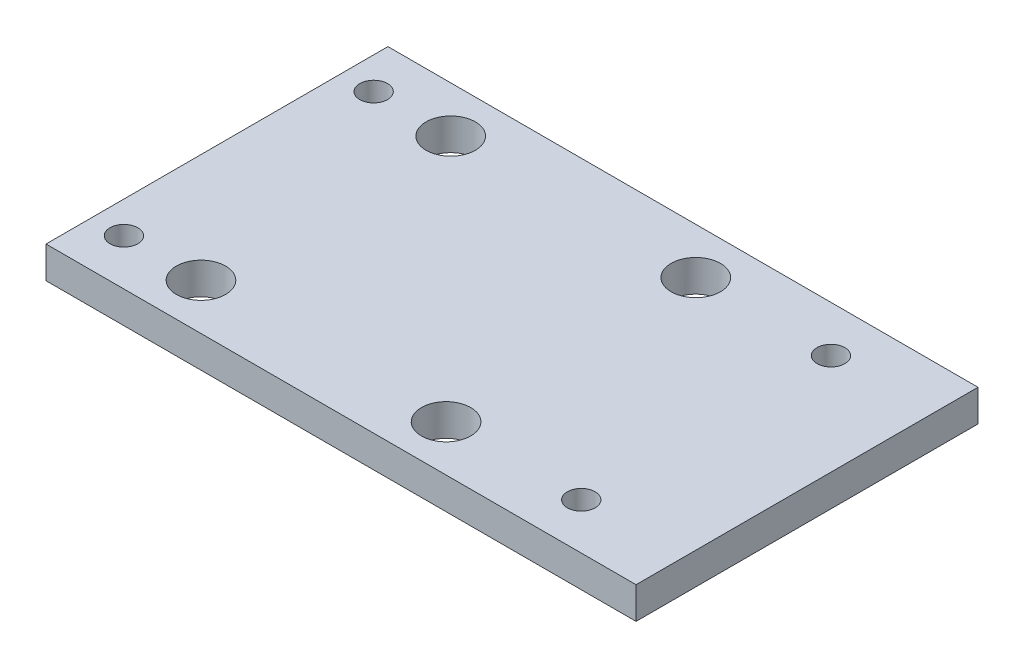
ISO-10303-21;
HEADER;
FILE_DESCRIPTION(('STEP AP214'),'2;1');
FILE_NAME('part.step','',(''),(''),'','','');
FILE_SCHEMA(('AUTOMOTIVE_DESIGN { 1 0 10303 214 1 1 1 1 }'));
ENDSEC;
DATA;
#1=APPLICATION_CONTEXT('core data for automotive mechanical design processes');
#2=APPLICATION_PROTOCOL_DEFINITION('international standard','automotive_design',2000,#1);
#3=PRODUCT_CONTEXT('',#1,'mechanical');
#4=PRODUCT('Part','Part','',(#3));
#5=PRODUCT_RELATED_PRODUCT_CATEGORY('part','',(#4));
#6=PRODUCT_DEFINITION_FORMATION('','',#4);
#7=PRODUCT_DEFINITION_CONTEXT('part definition',#1,'design');
#8=PRODUCT_DEFINITION('design','',#6,#7);
#9=PRODUCT_DEFINITION_SHAPE('','',#8);
#10=(LENGTH_UNIT() NAMED_UNIT(*) SI_UNIT(.MILLI.,.METRE.));
#11=(NAMED_UNIT(*) PLANE_ANGLE_UNIT() SI_UNIT($,.RADIAN.));
#12=(NAMED_UNIT(*) SI_UNIT($,.STERADIAN.) SOLID_ANGLE_UNIT());
#13=UNCERTAINTY_MEASURE_WITH_UNIT(LENGTH_MEASURE(1.E-05),#10,'distance_accuracy_value','');
#14=(GEOMETRIC_REPRESENTATION_CONTEXT(3) GLOBAL_UNCERTAINTY_ASSIGNED_CONTEXT((#13)) GLOBAL_UNIT_ASSIGNED_CONTEXT((#10,
#11,#12)) REPRESENTATION_CONTEXT('',''));
#15=CARTESIAN_POINT('',(0.,0.,0.));
#16=DIRECTION('',(0.,0.,1.));
#17=DIRECTION('',(1.,0.,0.));
#18=AXIS2_PLACEMENT_3D('',#15,#16,#17);
#19=CARTESIAN_POINT('',(-50.2,33.,43.));
#20=DIRECTION('',(0.,-1.,0.));
#21=DIRECTION('',(0.,0.,-1.));
#22=AXIS2_PLACEMENT_3D('',#19,#20,#21);
#23=PLANE('',#22);
#24=CARTESIAN_POINT('',(-5.69039910624969,33.,5.79827397082315));
#25=DIRECTION('',(0.,1.,0.));
#26=DIRECTION('',(0.,0.,1.));
#27=AXIS2_PLACEMENT_3D('',#24,#25,#26);
#28=CIRCLE('',#27,3.1);
#29=CARTESIAN_POINT('',(-5.69039910624969,33.,8.89827397082315));
#30=VERTEX_POINT('',#29);
#31=EDGE_CURVE('E145',#30,#30,#28,.T.);
#32=ORIENTED_EDGE('',*,*,#31,.F.);
#33=EDGE_LOOP('',(#32));
#34=FACE_BOUND('',#33,.T.);
#35=CARTESIAN_POINT('',(-5.69039910624968,33.,37.2017260291769));
#36=DIRECTION('',(0.,1.,0.));
#37=DIRECTION('',(0.,0.,1.));
#38=AXIS2_PLACEMENT_3D('',#35,#36,#37);
#39=CIRCLE('',#38,3.1);
#40=CARTESIAN_POINT('',(-5.69039910624968,33.,40.3017260291768));
#41=VERTEX_POINT('',#40);
#42=EDGE_CURVE('E153',#41,#41,#39,.T.);
#43=ORIENTED_EDGE('',*,*,#42,.F.);
#44=EDGE_LOOP('',(#43));
#45=FACE_BOUND('',#44,.T.);
#46=CARTESIAN_POINT('',(-36.5096008937503,33.,37.2017260291769));
#47=DIRECTION('',(0.,1.,0.));
#48=DIRECTION('',(0.,0.,1.));
#49=AXIS2_PLACEMENT_3D('',#46,#47,#48);
#50=CIRCLE('',#49,3.09999999999999);
#51=CARTESIAN_POINT('',(-36.5096008937503,33.,40.3017260291768));
#52=VERTEX_POINT('',#51);
#53=EDGE_CURVE('E149',#52,#52,#50,.T.);
#54=ORIENTED_EDGE('',*,*,#53,.F.);
#55=EDGE_LOOP('',(#54));
#56=FACE_BOUND('',#55,.T.);
#57=CARTESIAN_POINT('',(-46.2,33.,5.79827397082315));
#58=DIRECTION('',(0.,1.,0.));
#59=DIRECTION('',(0.,0.,1.));
#60=AXIS2_PLACEMENT_3D('',#57,#58,#59);
#61=CIRCLE('',#60,1.75);
#62=CARTESIAN_POINT('',(-46.2,33.,7.54827397082315));
#63=VERTEX_POINT('',#62);
#64=EDGE_CURVE('E146',#63,#63,#61,.T.);
#65=ORIENTED_EDGE('',*,*,#64,.F.);
#66=EDGE_LOOP('',(#65));
#67=FACE_BOUND('',#66,.T.);
#68=CARTESIAN_POINT('',(11.3096008937503,33.,37.2017260291769));
#69=DIRECTION('',(0.,1.,0.));
#70=DIRECTION('',(0.,0.,1.));
#71=AXIS2_PLACEMENT_3D('',#68,#69,#70);
#72=CIRCLE('',#71,1.75);
#73=CARTESIAN_POINT('',(11.3096008937503,33.,38.9517260291769));
#74=VERTEX_POINT('',#73);
#75=EDGE_CURVE('E161',#74,#74,#72,.T.);
#76=ORIENTED_EDGE('',*,*,#75,.F.);
#77=EDGE_LOOP('',(#76));
#78=FACE_BOUND('',#77,.T.);
#79=CARTESIAN_POINT('',(11.3096008937503,33.,5.79827397082315));
#80=DIRECTION('',(0.,1.,0.));
#81=DIRECTION('',(0.,0.,1.));
#82=AXIS2_PLACEMENT_3D('',#79,#80,#81);
#83=CIRCLE('',#82,1.75);
#84=CARTESIAN_POINT('',(11.3096008937503,33.,7.54827397082315));
#85=VERTEX_POINT('',#84);
#86=EDGE_CURVE('E158',#85,#85,#83,.T.);
#87=ORIENTED_EDGE('',*,*,#86,.F.);
#88=EDGE_LOOP('',(#87));
#89=FACE_BOUND('',#88,.T.);
#90=CARTESIAN_POINT('',(-46.2,33.,37.2017260291769));
#91=DIRECTION('',(0.,1.,0.));
#92=DIRECTION('',(0.,0.,1.));
#93=AXIS2_PLACEMENT_3D('',#90,#91,#92);
#94=CIRCLE('',#93,1.75);
#95=CARTESIAN_POINT('',(-46.2,33.,38.9517260291769));
#96=VERTEX_POINT('',#95);
#97=EDGE_CURVE('E150',#96,#96,#94,.T.);
#98=ORIENTED_EDGE('',*,*,#97,.F.);
#99=EDGE_LOOP('',(#98));
#100=FACE_BOUND('',#99,.T.);
#101=CARTESIAN_POINT('',(-36.5096008937503,33.,5.79827397082315));
#102=DIRECTION('',(0.,1.,0.));
#103=DIRECTION('',(0.,0.,1.));
#104=AXIS2_PLACEMENT_3D('',#101,#102,#103);
#105=CIRCLE('',#104,3.09999999999999);
#106=CARTESIAN_POINT('',(-36.5096008937503,33.,8.89827397082314));
#107=VERTEX_POINT('',#106);
#108=EDGE_CURVE('E114',#107,#107,#105,.T.);
#109=ORIENTED_EDGE('',*,*,#108,.F.);
#110=EDGE_LOOP('',(#109));
#111=FACE_BOUND('',#110,.T.);
#112=DIRECTION('',(-1.,0.,0.));
#113=VECTOR('',#112,1.);
#114=CARTESIAN_POINT('',(-50.2,33.,0.));
#115=LINE('',#114,#113);
#116=CARTESIAN_POINT('',(24.,33.,0.));
#117=VERTEX_POINT('',#116);
#118=CARTESIAN_POINT('',(-50.2,33.,0.));
#119=VERTEX_POINT('',#118);
#120=EDGE_CURVE('E105',#117,#119,#115,.T.);
#121=ORIENTED_EDGE('',*,*,#120,.T.);
#122=DIRECTION('',(0.,0.,-1.));
#123=VECTOR('',#122,1.);
#124=CARTESIAN_POINT('',(-50.2,33.,43.));
#125=LINE('',#124,#123);
#126=CARTESIAN_POINT('',(-50.2,33.,43.));
#127=VERTEX_POINT('',#126);
#128=EDGE_CURVE('E95',#127,#119,#125,.T.);
#129=ORIENTED_EDGE('',*,*,#128,.F.);
#130=DIRECTION('',(-1.,0.,0.));
#131=VECTOR('',#130,1.);
#132=CARTESIAN_POINT('',(-50.2,33.,43.));
#133=LINE('',#132,#131);
#134=CARTESIAN_POINT('',(24.,33.,43.));
#135=VERTEX_POINT('',#134);
#136=EDGE_CURVE('E83',#135,#127,#133,.T.);
#137=ORIENTED_EDGE('',*,*,#136,.F.);
#138=DIRECTION('',(0.,0.,-1.));
#139=VECTOR('',#138,1.);
#140=CARTESIAN_POINT('',(24.,33.,43.));
#141=LINE('',#140,#139);
#142=EDGE_CURVE('E89',#135,#117,#141,.T.);
#143=ORIENTED_EDGE('',*,*,#142,.T.);
#144=EDGE_LOOP('',(#121,#129,#137,#143));
#145=FACE_BOUND('',#144,.T.);
#146=ADVANCED_FACE('F41',(#34,#45,#56,#67,#78,#89,#100,#111,#145),#23,.F.);
#147=CARTESIAN_POINT('',(-46.2,18.,5.79827397082315));
#148=DIRECTION('',(0.,1.,0.));
#149=DIRECTION('',(0.,0.,1.));
#150=AXIS2_PLACEMENT_3D('',#147,#148,#149);
#151=CYLINDRICAL_SURFACE('',#150,1.75);
#152=CARTESIAN_POINT('',(-46.2,29.,5.79827397082315));
#153=DIRECTION('',(0.,1.,0.));
#154=DIRECTION('',(0.,0.,1.));
#155=AXIS2_PLACEMENT_3D('',#152,#153,#154);
#156=CIRCLE('',#155,1.75);
#157=CARTESIAN_POINT('',(-46.2,29.,7.54827397082315));
#158=VERTEX_POINT('',#157);
#159=EDGE_CURVE('E94',#158,#158,#156,.F.);
#160=ORIENTED_EDGE('',*,*,#159,.T.);
#161=EDGE_LOOP('',(#160));
#162=FACE_BOUND('',#161,.T.);
#163=ORIENTED_EDGE('',*,*,#64,.T.);
#164=EDGE_LOOP('',(#163));
#165=FACE_BOUND('',#164,.T.);
#166=ADVANCED_FACE('F171',(#162,#165),#151,.F.);
#167=CARTESIAN_POINT('',(-46.2,18.,37.2017260291769));
#168=DIRECTION('',(0.,1.,0.));
#169=DIRECTION('',(0.,0.,1.));
#170=AXIS2_PLACEMENT_3D('',#167,#168,#169);
#171=CYLINDRICAL_SURFACE('',#170,1.75);
#172=CARTESIAN_POINT('',(-46.2,29.,37.2017260291769));
#173=DIRECTION('',(0.,1.,0.));
#174=DIRECTION('',(0.,0.,1.));
#175=AXIS2_PLACEMENT_3D('',#172,#173,#174);
#176=CIRCLE('',#175,1.75);
#177=CARTESIAN_POINT('',(-46.2,29.,38.9517260291769));
#178=VERTEX_POINT('',#177);
#179=EDGE_CURVE('E125',#178,#178,#176,.F.);
#180=ORIENTED_EDGE('',*,*,#179,.T.);
#181=EDGE_LOOP('',(#180));
#182=FACE_BOUND('',#181,.T.);
#183=ORIENTED_EDGE('',*,*,#97,.T.);
#184=EDGE_LOOP('',(#183));
#185=FACE_BOUND('',#184,.T.);
#186=ADVANCED_FACE('F244',(#182,#185),#171,.F.);
#187=CARTESIAN_POINT('',(11.3096008937503,18.,37.2017260291769));
#188=DIRECTION('',(0.,1.,0.));
#189=DIRECTION('',(0.,0.,1.));
#190=AXIS2_PLACEMENT_3D('',#187,#188,#189);
#191=CYLINDRICAL_SURFACE('',#190,1.75);
#192=CARTESIAN_POINT('',(11.3096008937503,29.,37.2017260291769));
#193=DIRECTION('',(0.,1.,0.));
#194=DIRECTION('',(0.,0.,1.));
#195=AXIS2_PLACEMENT_3D('',#192,#193,#194);
#196=CIRCLE('',#195,1.75);
#197=CARTESIAN_POINT('',(11.3096008937503,29.,38.9517260291769));
#198=VERTEX_POINT('',#197);
#199=EDGE_CURVE('E128',#198,#198,#196,.F.);
#200=ORIENTED_EDGE('',*,*,#199,.T.);
#201=EDGE_LOOP('',(#200));
#202=FACE_BOUND('',#201,.T.);
#203=ORIENTED_EDGE('',*,*,#75,.T.);
#204=EDGE_LOOP('',(#203));
#205=FACE_BOUND('',#204,.T.);
#206=ADVANCED_FACE('F167',(#202,#205),#191,.F.);
#207=CARTESIAN_POINT('',(11.3096008937503,18.,5.79827397082315));
#208=DIRECTION('',(0.,1.,0.));
#209=DIRECTION('',(0.,0.,1.));
#210=AXIS2_PLACEMENT_3D('',#207,#208,#209);
#211=CYLINDRICAL_SURFACE('',#210,1.75);
#212=CARTESIAN_POINT('',(11.3096008937503,29.,5.79827397082315));
#213=DIRECTION('',(0.,1.,0.));
#214=DIRECTION('',(0.,0.,1.));
#215=AXIS2_PLACEMENT_3D('',#212,#213,#214);
#216=CIRCLE('',#215,1.75);
#217=CARTESIAN_POINT('',(11.3096008937503,29.,7.54827397082315));
#218=VERTEX_POINT('',#217);
#219=EDGE_CURVE('E131',#218,#218,#216,.F.);
#220=ORIENTED_EDGE('',*,*,#219,.T.);
#221=EDGE_LOOP('',(#220));
#222=FACE_BOUND('',#221,.T.);
#223=ORIENTED_EDGE('',*,*,#86,.T.);
#224=EDGE_LOOP('',(#223));
#225=FACE_BOUND('',#224,.T.);
#226=ADVANCED_FACE('F243',(#222,#225),#211,.F.);
#227=CARTESIAN_POINT('',(-5.69039910624969,18.,5.79827397082315));
#228=DIRECTION('',(0.,1.,0.));
#229=DIRECTION('',(0.,0.,1.));
#230=AXIS2_PLACEMENT_3D('',#227,#228,#229);
#231=CYLINDRICAL_SURFACE('',#230,3.1);
#232=CARTESIAN_POINT('',(-5.69039910624969,29.,5.79827397082315));
#233=DIRECTION('',(0.,-1.,0.));
#234=DIRECTION('',(0.,0.,-1.));
#235=AXIS2_PLACEMENT_3D('',#232,#233,#234);
#236=CIRCLE('',#235,3.1);
#237=CARTESIAN_POINT('',(-5.69039910624969,29.,2.69827397082314));
#238=VERTEX_POINT('',#237);
#239=EDGE_CURVE('E120',#238,#238,#236,.T.);
#240=ORIENTED_EDGE('',*,*,#239,.T.);
#241=EDGE_LOOP('',(#240));
#242=FACE_BOUND('',#241,.T.);
#243=ORIENTED_EDGE('',*,*,#31,.T.);
#244=EDGE_LOOP('',(#243));
#245=FACE_BOUND('',#244,.T.);
#246=ADVANCED_FACE('F263',(#242,#245),#231,.F.);
#247=CARTESIAN_POINT('',(-5.69039910624968,18.,37.2017260291769));
#248=DIRECTION('',(0.,1.,0.));
#249=DIRECTION('',(0.,0.,1.));
#250=AXIS2_PLACEMENT_3D('',#247,#248,#249);
#251=CYLINDRICAL_SURFACE('',#250,3.1);
#252=CARTESIAN_POINT('',(-5.69039910624968,29.,37.2017260291769));
#253=DIRECTION('',(0.,-1.,0.));
#254=DIRECTION('',(0.,0.,-1.));
#255=AXIS2_PLACEMENT_3D('',#252,#253,#254);
#256=CIRCLE('',#255,3.1);
#257=CARTESIAN_POINT('',(-5.69039910624968,29.,34.1017260291769));
#258=VERTEX_POINT('',#257);
#259=EDGE_CURVE('E117',#258,#258,#256,.T.);
#260=ORIENTED_EDGE('',*,*,#259,.T.);
#261=EDGE_LOOP('',(#260));
#262=FACE_BOUND('',#261,.T.);
#263=ORIENTED_EDGE('',*,*,#42,.T.);
#264=EDGE_LOOP('',(#263));
#265=FACE_BOUND('',#264,.T.);
#266=ADVANCED_FACE('F188',(#262,#265),#251,.F.);
#267=CARTESIAN_POINT('',(-36.5096008937503,18.,37.2017260291769));
#268=DIRECTION('',(0.,1.,0.));
#269=DIRECTION('',(0.,0.,1.));
#270=AXIS2_PLACEMENT_3D('',#267,#268,#269);
#271=CYLINDRICAL_SURFACE('',#270,3.09999999999999);
#272=CARTESIAN_POINT('',(-36.5096008937503,29.,37.2017260291769));
#273=DIRECTION('',(0.,-1.,0.));
#274=DIRECTION('',(0.,0.,-1.));
#275=AXIS2_PLACEMENT_3D('',#272,#273,#274);
#276=CIRCLE('',#275,3.09999999999999);
#277=CARTESIAN_POINT('',(-36.5096008937503,29.,34.1017260291769));
#278=VERTEX_POINT('',#277);
#279=EDGE_CURVE('E113',#278,#278,#276,.T.);
#280=ORIENTED_EDGE('',*,*,#279,.T.);
#281=EDGE_LOOP('',(#280));
#282=FACE_BOUND('',#281,.T.);
#283=ORIENTED_EDGE('',*,*,#53,.T.);
#284=EDGE_LOOP('',(#283));
#285=FACE_BOUND('',#284,.T.);
#286=ADVANCED_FACE('F181',(#282,#285),#271,.F.);
#287=CARTESIAN_POINT('',(-36.5096008937503,18.,5.79827397082315));
#288=DIRECTION('',(0.,1.,0.));
#289=DIRECTION('',(0.,0.,1.));
#290=AXIS2_PLACEMENT_3D('',#287,#288,#289);
#291=CYLINDRICAL_SURFACE('',#290,3.09999999999999);
#292=CARTESIAN_POINT('',(-36.5096008937503,29.,5.79827397082315));
#293=DIRECTION('',(0.,-1.,0.));
#294=DIRECTION('',(0.,0.,-1.));
#295=AXIS2_PLACEMENT_3D('',#292,#293,#294);
#296=CIRCLE('',#295,3.09999999999999);
#297=CARTESIAN_POINT('',(-36.5096008937503,29.,2.69827397082315));
#298=VERTEX_POINT('',#297);
#299=EDGE_CURVE('E110',#298,#298,#296,.T.);
#300=ORIENTED_EDGE('',*,*,#299,.T.);
#301=EDGE_LOOP('',(#300));
#302=FACE_BOUND('',#301,.T.);
#303=ORIENTED_EDGE('',*,*,#108,.T.);
#304=EDGE_LOOP('',(#303));
#305=FACE_BOUND('',#304,.T.);
#306=ADVANCED_FACE('F179',(#302,#305),#291,.F.);
#307=CARTESIAN_POINT('',(24.,33.,43.));
#308=DIRECTION('',(-1.,0.,0.));
#309=DIRECTION('',(0.,-1.,0.));
#310=AXIS2_PLACEMENT_3D('',#307,#308,#309);
#311=PLANE('',#310);
#312=DIRECTION('',(0.,1.,0.));
#313=VECTOR('',#312,1.);
#314=CARTESIAN_POINT('',(24.,33.,43.));
#315=LINE('',#314,#313);
#316=CARTESIAN_POINT('',(24.,29.,43.));
#317=VERTEX_POINT('',#316);
#318=EDGE_CURVE('E79',#317,#135,#315,.T.);
#319=ORIENTED_EDGE('',*,*,#318,.F.);
#320=DIRECTION('',(0.,0.,-1.));
#321=VECTOR('',#320,1.);
#322=CARTESIAN_POINT('',(24.,29.,43.));
#323=LINE('',#322,#321);
#324=CARTESIAN_POINT('',(24.,29.,0.));
#325=VERTEX_POINT('',#324);
#326=EDGE_CURVE('E12',#317,#325,#323,.T.);
#327=ORIENTED_EDGE('',*,*,#326,.T.);
#328=DIRECTION('',(0.,1.,0.));
#329=VECTOR('',#328,1.);
#330=CARTESIAN_POINT('',(24.,33.,0.));
#331=LINE('',#330,#329);
#332=EDGE_CURVE('E91',#325,#117,#331,.T.);
#333=ORIENTED_EDGE('',*,*,#332,.T.);
#334=ORIENTED_EDGE('',*,*,#142,.F.);
#335=EDGE_LOOP('',(#319,#327,#333,#334));
#336=FACE_BOUND('',#335,.T.);
#337=ADVANCED_FACE('F43',(#336),#311,.F.);
#338=CARTESIAN_POINT('',(-50.2,33.,43.));
#339=DIRECTION('',(1.,0.,0.));
#340=DIRECTION('',(0.,1.,0.));
#341=AXIS2_PLACEMENT_3D('',#338,#339,#340);
#342=PLANE('',#341);
#343=DIRECTION('',(0.,-1.,0.));
#344=VECTOR('',#343,1.);
#345=CARTESIAN_POINT('',(-50.2,33.,0.));
#346=LINE('',#345,#344);
#347=CARTESIAN_POINT('',(-50.2,29.,0.));
#348=VERTEX_POINT('',#347);
#349=EDGE_CURVE('E86',#119,#348,#346,.T.);
#350=ORIENTED_EDGE('',*,*,#349,.T.);
#351=DIRECTION('',(0.,0.,1.));
#352=VECTOR('',#351,1.);
#353=CARTESIAN_POINT('',(-50.2,29.,43.));
#354=LINE('',#353,#352);
#355=CARTESIAN_POINT('',(-50.2,29.,43.));
#356=VERTEX_POINT('',#355);
#357=EDGE_CURVE('E45',#348,#356,#354,.T.);
#358=ORIENTED_EDGE('',*,*,#357,.T.);
#359=DIRECTION('',(0.,-1.,0.));
#360=VECTOR('',#359,1.);
#361=CARTESIAN_POINT('',(-50.2,33.,43.));
#362=LINE('',#361,#360);
#363=EDGE_CURVE('E99',#127,#356,#362,.T.);
#364=ORIENTED_EDGE('',*,*,#363,.F.);
#365=ORIENTED_EDGE('',*,*,#128,.T.);
#366=EDGE_LOOP('',(#350,#358,#364,#365));
#367=FACE_BOUND('',#366,.T.);
#368=ADVANCED_FACE('F137',(#367),#342,.F.);
#369=CARTESIAN_POINT('',(0.,0.,43.));
#370=DIRECTION('',(0.,0.,-1.));
#371=DIRECTION('',(-1.,0.,0.));
#372=AXIS2_PLACEMENT_3D('',#369,#370,#371);
#373=PLANE('',#372);
#374=ORIENTED_EDGE('',*,*,#363,.T.);
#375=DIRECTION('',(-1.,0.,0.));
#376=VECTOR('',#375,1.);
#377=CARTESIAN_POINT('',(-42.2,29.,43.));
#378=LINE('',#377,#376);
#379=EDGE_CURVE('E56',#317,#356,#378,.T.);
#380=ORIENTED_EDGE('',*,*,#379,.F.);
#381=ORIENTED_EDGE('',*,*,#318,.T.);
#382=ORIENTED_EDGE('',*,*,#136,.T.);
#383=EDGE_LOOP('',(#374,#380,#381,#382));
#384=FACE_BOUND('',#383,.T.);
#385=ADVANCED_FACE('F81',(#384),#373,.F.);
#386=CARTESIAN_POINT('',(0.,0.,0.));
#387=DIRECTION('',(0.,0.,-1.));
#388=DIRECTION('',(-1.,0.,0.));
#389=AXIS2_PLACEMENT_3D('',#386,#387,#388);
#390=PLANE('',#389);
#391=DIRECTION('',(-1.,0.,0.));
#392=VECTOR('',#391,1.);
#393=CARTESIAN_POINT('',(-42.2,29.,0.));
#394=LINE('',#393,#392);
#395=EDGE_CURVE('E63',#325,#348,#394,.T.);
#396=ORIENTED_EDGE('',*,*,#395,.T.);
#397=ORIENTED_EDGE('',*,*,#349,.F.);
#398=ORIENTED_EDGE('',*,*,#120,.F.);
#399=ORIENTED_EDGE('',*,*,#332,.F.);
#400=EDGE_LOOP('',(#396,#397,#398,#399));
#401=FACE_BOUND('',#400,.T.);
#402=ADVANCED_FACE('F194',(#401),#390,.T.);
#403=CARTESIAN_POINT('',(-42.2,29.,43.));
#404=DIRECTION('',(0.,-1.,0.));
#405=DIRECTION('',(0.,0.,-1.));
#406=AXIS2_PLACEMENT_3D('',#403,#404,#405);
#407=PLANE('',#406);
#408=ORIENTED_EDGE('',*,*,#239,.F.);
#409=EDGE_LOOP('',(#408));
#410=FACE_BOUND('',#409,.T.);
#411=ORIENTED_EDGE('',*,*,#259,.F.);
#412=EDGE_LOOP('',(#411));
#413=FACE_BOUND('',#412,.T.);
#414=ORIENTED_EDGE('',*,*,#279,.F.);
#415=EDGE_LOOP('',(#414));
#416=FACE_BOUND('',#415,.T.);
#417=ORIENTED_EDGE('',*,*,#299,.F.);
#418=EDGE_LOOP('',(#417));
#419=FACE_BOUND('',#418,.T.);
#420=ORIENTED_EDGE('',*,*,#395,.F.);
#421=ORIENTED_EDGE('',*,*,#326,.F.);
#422=ORIENTED_EDGE('',*,*,#379,.T.);
#423=ORIENTED_EDGE('',*,*,#357,.F.);
#424=EDGE_LOOP('',(#420,#421,#422,#423));
#425=FACE_BOUND('',#424,.T.);
#426=ORIENTED_EDGE('',*,*,#199,.F.);
#427=EDGE_LOOP('',(#426));
#428=FACE_BOUND('',#427,.T.);
#429=ORIENTED_EDGE('',*,*,#219,.F.);
#430=EDGE_LOOP('',(#429));
#431=FACE_BOUND('',#430,.T.);
#432=ORIENTED_EDGE('',*,*,#159,.F.);
#433=EDGE_LOOP('',(#432));
#434=FACE_BOUND('',#433,.T.);
#435=ORIENTED_EDGE('',*,*,#179,.F.);
#436=EDGE_LOOP('',(#435));
#437=FACE_BOUND('',#436,.T.);
#438=ADVANCED_FACE('F139',(#410,#413,#416,#419,#425,#428,#431,#434,#437),#407,.T.);
#439=CLOSED_SHELL('',(#146,#166,#186,#206,#226,#246,#266,#286,#306,#337,#368,#385,#402,#438));
#440=MANIFOLD_SOLID_BREP('B2',#439);
#441=ADVANCED_BREP_SHAPE_REPRESENTATION('',(#18,#440),#14);
#442=SHAPE_DEFINITION_REPRESENTATION(#9,#441);
ENDSEC;
END-ISO-10303-21;
